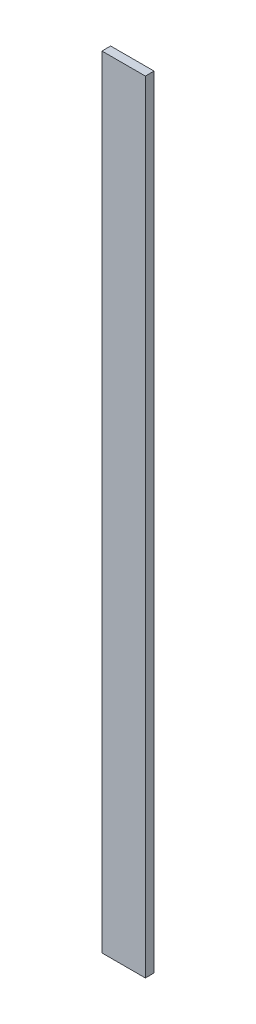
ISO-10303-21;
HEADER;
FILE_DESCRIPTION(('STEP AP214'),'2;1');
FILE_NAME('part.step','',(''),(''),'','','');
FILE_SCHEMA(('AUTOMOTIVE_DESIGN { 1 0 10303 214 1 1 1 1 }'));
ENDSEC;
DATA;
#1=APPLICATION_CONTEXT('core data for automotive mechanical design processes');
#2=APPLICATION_PROTOCOL_DEFINITION('international standard','automotive_design',2000,#1);
#3=PRODUCT_CONTEXT('',#1,'mechanical');
#4=PRODUCT('Part','Part','',(#3));
#5=PRODUCT_RELATED_PRODUCT_CATEGORY('part','',(#4));
#6=PRODUCT_DEFINITION_FORMATION('','',#4);
#7=PRODUCT_DEFINITION_CONTEXT('part definition',#1,'design');
#8=PRODUCT_DEFINITION('design','',#6,#7);
#9=PRODUCT_DEFINITION_SHAPE('','',#8);
#10=(LENGTH_UNIT() NAMED_UNIT(*) SI_UNIT(.MILLI.,.METRE.));
#11=(NAMED_UNIT(*) PLANE_ANGLE_UNIT() SI_UNIT($,.RADIAN.));
#12=(NAMED_UNIT(*) SI_UNIT($,.STERADIAN.) SOLID_ANGLE_UNIT());
#13=UNCERTAINTY_MEASURE_WITH_UNIT(LENGTH_MEASURE(1.E-05),#10,'distance_accuracy_value','');
#14=(GEOMETRIC_REPRESENTATION_CONTEXT(3) GLOBAL_UNCERTAINTY_ASSIGNED_CONTEXT((#13)) GLOBAL_UNIT_ASSIGNED_CONTEXT((#10,
#11,#12)) REPRESENTATION_CONTEXT('',''));
#15=CARTESIAN_POINT('',(0.,0.,0.));
#16=DIRECTION('',(0.,0.,1.));
#17=DIRECTION('',(1.,0.,0.));
#18=AXIS2_PLACEMENT_3D('',#15,#16,#17);
#19=CARTESIAN_POINT('',(25.,900.,5.));
#20=DIRECTION('',(-1.,0.,0.));
#21=DIRECTION('',(0.,0.,1.));
#22=AXIS2_PLACEMENT_3D('',#19,#20,#21);
#23=PLANE('',#22);
#24=DIRECTION('',(0.,0.,-1.));
#25=VECTOR('',#24,1.);
#26=CARTESIAN_POINT('',(25.,0.,5.));
#27=LINE('',#26,#25);
#28=CARTESIAN_POINT('',(25.,0.,5.));
#29=VERTEX_POINT('',#28);
#30=CARTESIAN_POINT('',(25.,0.,-5.));
#31=VERTEX_POINT('',#30);
#32=EDGE_CURVE('E96',#29,#31,#27,.T.);
#33=ORIENTED_EDGE('',*,*,#32,.T.);
#34=DIRECTION('',(0.,-1.,0.));
#35=VECTOR('',#34,1.);
#36=CARTESIAN_POINT('',(25.,900.,-5.));
#37=LINE('',#36,#35);
#38=CARTESIAN_POINT('',(25.,900.,-5.));
#39=VERTEX_POINT('',#38);
#40=EDGE_CURVE('E11',#39,#31,#37,.T.);
#41=ORIENTED_EDGE('',*,*,#40,.F.);
#42=DIRECTION('',(0.,0.,-1.));
#43=VECTOR('',#42,1.);
#44=CARTESIAN_POINT('',(25.,900.,5.));
#45=LINE('',#44,#43);
#46=CARTESIAN_POINT('',(25.,900.,5.));
#47=VERTEX_POINT('',#46);
#48=EDGE_CURVE('E84',#47,#39,#45,.T.);
#49=ORIENTED_EDGE('',*,*,#48,.F.);
#50=DIRECTION('',(0.,-1.,0.));
#51=VECTOR('',#50,1.);
#52=CARTESIAN_POINT('',(25.,900.,5.));
#53=LINE('',#52,#51);
#54=EDGE_CURVE('E92',#47,#29,#53,.T.);
#55=ORIENTED_EDGE('',*,*,#54,.T.);
#56=EDGE_LOOP('',(#33,#41,#49,#55));
#57=FACE_BOUND('',#56,.T.);
#58=ADVANCED_FACE('F33',(#57),#23,.F.);
#59=CARTESIAN_POINT('',(-25.,900.,-5.));
#60=DIRECTION('',(0.,0.,1.));
#61=DIRECTION('',(1.,0.,0.));
#62=AXIS2_PLACEMENT_3D('',#59,#60,#61);
#63=PLANE('',#62);
#64=DIRECTION('',(-1.,0.,0.));
#65=VECTOR('',#64,1.);
#66=CARTESIAN_POINT('',(-25.,0.,-5.));
#67=LINE('',#66,#65);
#68=CARTESIAN_POINT('',(-25.,0.,-5.));
#69=VERTEX_POINT('',#68);
#70=EDGE_CURVE('E88',#31,#69,#67,.T.);
#71=ORIENTED_EDGE('',*,*,#70,.T.);
#72=DIRECTION('',(0.,-1.,0.));
#73=VECTOR('',#72,1.);
#74=CARTESIAN_POINT('',(-25.,900.,-5.));
#75=LINE('',#74,#73);
#76=CARTESIAN_POINT('',(-25.,900.,-5.));
#77=VERTEX_POINT('',#76);
#78=EDGE_CURVE('E41',#77,#69,#75,.T.);
#79=ORIENTED_EDGE('',*,*,#78,.F.);
#80=DIRECTION('',(-1.,0.,0.));
#81=VECTOR('',#80,1.);
#82=CARTESIAN_POINT('',(-25.,900.,-5.));
#83=LINE('',#82,#81);
#84=EDGE_CURVE('E79',#39,#77,#83,.T.);
#85=ORIENTED_EDGE('',*,*,#84,.F.);
#86=ORIENTED_EDGE('',*,*,#40,.T.);
#87=EDGE_LOOP('',(#71,#79,#85,#86));
#88=FACE_BOUND('',#87,.T.);
#89=ADVANCED_FACE('F87',(#88),#63,.F.);
#90=CARTESIAN_POINT('',(-25.,900.,5.));
#91=DIRECTION('',(1.,0.,0.));
#92=DIRECTION('',(0.,0.,-1.));
#93=AXIS2_PLACEMENT_3D('',#90,#91,#92);
#94=PLANE('',#93);
#95=DIRECTION('',(0.,0.,1.));
#96=VECTOR('',#95,1.);
#97=CARTESIAN_POINT('',(-25.,0.,5.));
#98=LINE('',#97,#96);
#99=CARTESIAN_POINT('',(-25.,0.,5.));
#100=VERTEX_POINT('',#99);
#101=EDGE_CURVE('E66',#69,#100,#98,.T.);
#102=ORIENTED_EDGE('',*,*,#101,.T.);
#103=DIRECTION('',(0.,-1.,0.));
#104=VECTOR('',#103,1.);
#105=CARTESIAN_POINT('',(-25.,900.,5.));
#106=LINE('',#105,#104);
#107=CARTESIAN_POINT('',(-25.,900.,5.));
#108=VERTEX_POINT('',#107);
#109=EDGE_CURVE('E89',#108,#100,#106,.T.);
#110=ORIENTED_EDGE('',*,*,#109,.F.);
#111=DIRECTION('',(0.,0.,1.));
#112=VECTOR('',#111,1.);
#113=CARTESIAN_POINT('',(-25.,900.,5.));
#114=LINE('',#113,#112);
#115=EDGE_CURVE('E82',#77,#108,#114,.T.);
#116=ORIENTED_EDGE('',*,*,#115,.F.);
#117=ORIENTED_EDGE('',*,*,#78,.T.);
#118=EDGE_LOOP('',(#102,#110,#116,#117));
#119=FACE_BOUND('',#118,.T.);
#120=ADVANCED_FACE('F90',(#119),#94,.F.);
#121=CARTESIAN_POINT('',(-25.,900.,5.));
#122=DIRECTION('',(0.,0.,-1.));
#123=DIRECTION('',(-1.,0.,0.));
#124=AXIS2_PLACEMENT_3D('',#121,#122,#123);
#125=PLANE('',#124);
#126=DIRECTION('',(1.,0.,0.));
#127=VECTOR('',#126,1.);
#128=CARTESIAN_POINT('',(-25.,0.,5.));
#129=LINE('',#128,#127);
#130=EDGE_CURVE('E72',#100,#29,#129,.T.);
#131=ORIENTED_EDGE('',*,*,#130,.T.);
#132=ORIENTED_EDGE('',*,*,#54,.F.);
#133=DIRECTION('',(1.,0.,0.));
#134=VECTOR('',#133,1.);
#135=CARTESIAN_POINT('',(-25.,900.,5.));
#136=LINE('',#135,#134);
#137=EDGE_CURVE('E49',#108,#47,#136,.T.);
#138=ORIENTED_EDGE('',*,*,#137,.F.);
#139=ORIENTED_EDGE('',*,*,#109,.T.);
#140=EDGE_LOOP('',(#131,#132,#138,#139));
#141=FACE_BOUND('',#140,.T.);
#142=ADVANCED_FACE('F103',(#141),#125,.F.);
#143=CARTESIAN_POINT('',(0.,900.,0.));
#144=DIRECTION('',(0.,-1.,0.));
#145=DIRECTION('',(0.,0.,-1.));
#146=AXIS2_PLACEMENT_3D('',#143,#144,#145);
#147=PLANE('',#146);
#148=ORIENTED_EDGE('',*,*,#48,.T.);
#149=ORIENTED_EDGE('',*,*,#84,.T.);
#150=ORIENTED_EDGE('',*,*,#115,.T.);
#151=ORIENTED_EDGE('',*,*,#137,.T.);
#152=EDGE_LOOP('',(#148,#149,#150,#151));
#153=FACE_BOUND('',#152,.T.);
#154=ADVANCED_FACE('F80',(#153),#147,.F.);
#155=CARTESIAN_POINT('',(0.,0.,0.));
#156=DIRECTION('',(0.,-1.,0.));
#157=DIRECTION('',(0.,0.,-1.));
#158=AXIS2_PLACEMENT_3D('',#155,#156,#157);
#159=PLANE('',#158);
#160=ORIENTED_EDGE('',*,*,#32,.F.);
#161=ORIENTED_EDGE('',*,*,#130,.F.);
#162=ORIENTED_EDGE('',*,*,#101,.F.);
#163=ORIENTED_EDGE('',*,*,#70,.F.);
#164=EDGE_LOOP('',(#160,#161,#162,#163));
#165=FACE_BOUND('',#164,.T.);
#166=ADVANCED_FACE('F106',(#165),#159,.T.);
#167=CLOSED_SHELL('',(#58,#89,#120,#142,#154,#166));
#168=MANIFOLD_SOLID_BREP('B2',#167);
#169=ADVANCED_BREP_SHAPE_REPRESENTATION('',(#18,#168),#14);
#170=SHAPE_DEFINITION_REPRESENTATION(#9,#169);
ENDSEC;
END-ISO-10303-21;
